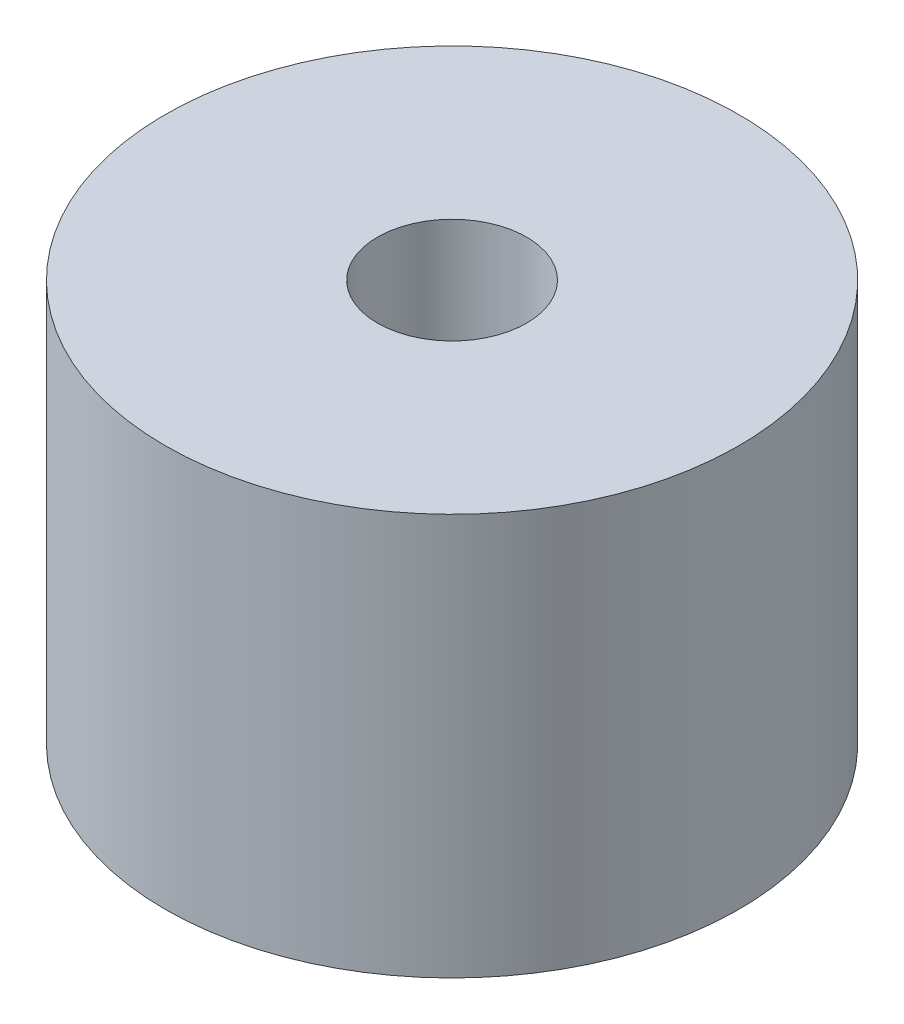
ISO-10303-21;
HEADER;
FILE_DESCRIPTION(('STEP AP214'),'2;1');
FILE_NAME('part.step','',(''),(''),'','','');
FILE_SCHEMA(('AUTOMOTIVE_DESIGN { 1 0 10303 214 1 1 1 1 }'));
ENDSEC;
DATA;
#1=APPLICATION_CONTEXT('core data for automotive mechanical design processes');
#2=APPLICATION_PROTOCOL_DEFINITION('international standard','automotive_design',2000,#1);
#3=PRODUCT_CONTEXT('',#1,'mechanical');
#4=PRODUCT('Part','Part','',(#3));
#5=PRODUCT_RELATED_PRODUCT_CATEGORY('part','',(#4));
#6=PRODUCT_DEFINITION_FORMATION('','',#4);
#7=PRODUCT_DEFINITION_CONTEXT('part definition',#1,'design');
#8=PRODUCT_DEFINITION('design','',#6,#7);
#9=PRODUCT_DEFINITION_SHAPE('','',#8);
#10=(LENGTH_UNIT() NAMED_UNIT(*) SI_UNIT(.MILLI.,.METRE.));
#11=(NAMED_UNIT(*) PLANE_ANGLE_UNIT() SI_UNIT($,.RADIAN.));
#12=(NAMED_UNIT(*) SI_UNIT($,.STERADIAN.) SOLID_ANGLE_UNIT());
#13=UNCERTAINTY_MEASURE_WITH_UNIT(LENGTH_MEASURE(1.E-05),#10,'distance_accuracy_value','');
#14=(GEOMETRIC_REPRESENTATION_CONTEXT(3) GLOBAL_UNCERTAINTY_ASSIGNED_CONTEXT((#13)) GLOBAL_UNIT_ASSIGNED_CONTEXT((#10,
#11,#12)) REPRESENTATION_CONTEXT('',''));
#15=CARTESIAN_POINT('',(0.,0.,0.));
#16=DIRECTION('',(0.,0.,1.));
#17=DIRECTION('',(1.,0.,0.));
#18=AXIS2_PLACEMENT_3D('',#15,#16,#17);
#19=CARTESIAN_POINT('',(0.,35.,0.));
#20=DIRECTION('',(0.,-1.,0.));
#21=DIRECTION('',(0.,0.,-1.));
#22=AXIS2_PLACEMENT_3D('',#19,#20,#21);
#23=CYLINDRICAL_SURFACE('',#22,25.);
#24=CARTESIAN_POINT('',(0.,35.,0.));
#25=DIRECTION('',(0.,1.,0.));
#26=DIRECTION('',(0.,0.,1.));
#27=AXIS2_PLACEMENT_3D('',#24,#25,#26);
#28=CIRCLE('',#27,25.);
#29=CARTESIAN_POINT('',(0.,35.,25.));
#30=VERTEX_POINT('',#29);
#31=EDGE_CURVE('E10',#30,#30,#28,.T.);
#32=ORIENTED_EDGE('',*,*,#31,.F.);
#33=EDGE_LOOP('',(#32));
#34=FACE_BOUND('',#33,.T.);
#35=CARTESIAN_POINT('',(0.,0.,0.));
#36=DIRECTION('',(0.,1.,0.));
#37=DIRECTION('',(0.,0.,1.));
#38=AXIS2_PLACEMENT_3D('',#35,#36,#37);
#39=CIRCLE('',#38,25.);
#40=CARTESIAN_POINT('',(0.,0.,25.));
#41=VERTEX_POINT('',#40);
#42=EDGE_CURVE('E40',#41,#41,#39,.T.);
#43=ORIENTED_EDGE('',*,*,#42,.T.);
#44=EDGE_LOOP('',(#43));
#45=FACE_BOUND('',#44,.T.);
#46=ADVANCED_FACE('F37',(#34,#45),#23,.T.);
#47=CARTESIAN_POINT('',(0.,35.,0.));
#48=DIRECTION('',(0.,1.,0.));
#49=DIRECTION('',(0.,0.,1.));
#50=AXIS2_PLACEMENT_3D('',#47,#48,#49);
#51=PLANE('',#50);
#52=CARTESIAN_POINT('',(0.,35.,0.));
#53=DIRECTION('',(0.,1.,0.));
#54=DIRECTION('',(0.,0.,1.));
#55=AXIS2_PLACEMENT_3D('',#52,#53,#54);
#56=CIRCLE('',#55,6.5);
#57=CARTESIAN_POINT('',(0.,35.,6.5));
#58=VERTEX_POINT('',#57);
#59=EDGE_CURVE('E51',#58,#58,#56,.T.);
#60=ORIENTED_EDGE('',*,*,#59,.F.);
#61=EDGE_LOOP('',(#60));
#62=FACE_BOUND('',#61,.T.);
#63=ORIENTED_EDGE('',*,*,#31,.T.);
#64=EDGE_LOOP('',(#63));
#65=FACE_BOUND('',#64,.T.);
#66=ADVANCED_FACE('F108',(#62,#65),#51,.T.);
#67=CARTESIAN_POINT('',(0.,0.,0.));
#68=DIRECTION('',(0.,1.,0.));
#69=DIRECTION('',(0.,0.,1.));
#70=AXIS2_PLACEMENT_3D('',#67,#68,#69);
#71=PLANE('',#70);
#72=CARTESIAN_POINT('',(0.,0.,0.));
#73=DIRECTION('',(0.,1.,0.));
#74=DIRECTION('',(0.,0.,1.));
#75=AXIS2_PLACEMENT_3D('',#72,#73,#74);
#76=CIRCLE('',#75,1.5);
#77=CARTESIAN_POINT('',(0.,0.,1.5));
#78=VERTEX_POINT('',#77);
#79=EDGE_CURVE('E63',#78,#78,#76,.T.);
#80=ORIENTED_EDGE('',*,*,#79,.T.);
#81=EDGE_LOOP('',(#80));
#82=FACE_BOUND('',#81,.T.);
#83=ORIENTED_EDGE('',*,*,#42,.F.);
#84=EDGE_LOOP('',(#83));
#85=FACE_BOUND('',#84,.T.);
#86=ADVANCED_FACE('F75',(#82,#85),#71,.F.);
#87=CARTESIAN_POINT('',(0.,5.,0.));
#88=DIRECTION('',(0.,1.,0.));
#89=DIRECTION('',(0.,0.,1.));
#90=AXIS2_PLACEMENT_3D('',#87,#88,#89);
#91=CYLINDRICAL_SURFACE('',#90,6.5);
#92=CARTESIAN_POINT('',(0.,5.,0.));
#93=DIRECTION('',(0.,1.,0.));
#94=DIRECTION('',(0.,0.,1.));
#95=AXIS2_PLACEMENT_3D('',#92,#93,#94);
#96=CIRCLE('',#95,6.5);
#97=CARTESIAN_POINT('',(0.,5.,6.5));
#98=VERTEX_POINT('',#97);
#99=EDGE_CURVE('E49',#98,#98,#96,.T.);
#100=ORIENTED_EDGE('',*,*,#99,.F.);
#101=EDGE_LOOP('',(#100));
#102=FACE_BOUND('',#101,.T.);
#103=ORIENTED_EDGE('',*,*,#59,.T.);
#104=EDGE_LOOP('',(#103));
#105=FACE_BOUND('',#104,.T.);
#106=ADVANCED_FACE('F99',(#102,#105),#91,.F.);
#107=CARTESIAN_POINT('',(0.,5.,0.));
#108=DIRECTION('',(0.,1.,0.));
#109=DIRECTION('',(0.,0.,1.));
#110=AXIS2_PLACEMENT_3D('',#107,#108,#109);
#111=PLANE('',#110);
#112=CARTESIAN_POINT('',(0.,5.,0.));
#113=DIRECTION('',(0.,1.,0.));
#114=DIRECTION('',(0.,0.,1.));
#115=AXIS2_PLACEMENT_3D('',#112,#113,#114);
#116=CIRCLE('',#115,2.5);
#117=CARTESIAN_POINT('',(0.,5.,2.5));
#118=VERTEX_POINT('',#117);
#119=EDGE_CURVE('E59',#118,#118,#116,.T.);
#120=ORIENTED_EDGE('',*,*,#119,.F.);
#121=EDGE_LOOP('',(#120));
#122=FACE_BOUND('',#121,.T.);
#123=ORIENTED_EDGE('',*,*,#99,.T.);
#124=EDGE_LOOP('',(#123));
#125=FACE_BOUND('',#124,.T.);
#126=ADVANCED_FACE('F93',(#122,#125),#111,.T.);
#127=CARTESIAN_POINT('',(0.,2.,0.));
#128=DIRECTION('',(0.,1.,0.));
#129=DIRECTION('',(0.,0.,1.));
#130=AXIS2_PLACEMENT_3D('',#127,#128,#129);
#131=CYLINDRICAL_SURFACE('',#130,2.5);
#132=CARTESIAN_POINT('',(0.,2.,0.));
#133=DIRECTION('',(0.,1.,0.));
#134=DIRECTION('',(0.,0.,1.));
#135=AXIS2_PLACEMENT_3D('',#132,#133,#134);
#136=CIRCLE('',#135,2.5);
#137=CARTESIAN_POINT('',(0.,2.,2.5));
#138=VERTEX_POINT('',#137);
#139=EDGE_CURVE('E55',#138,#138,#136,.T.);
#140=ORIENTED_EDGE('',*,*,#139,.F.);
#141=EDGE_LOOP('',(#140));
#142=FACE_BOUND('',#141,.T.);
#143=ORIENTED_EDGE('',*,*,#119,.T.);
#144=EDGE_LOOP('',(#143));
#145=FACE_BOUND('',#144,.T.);
#146=ADVANCED_FACE('F87',(#142,#145),#131,.F.);
#147=CARTESIAN_POINT('',(0.,2.,0.));
#148=DIRECTION('',(0.,1.,0.));
#149=DIRECTION('',(0.,0.,1.));
#150=AXIS2_PLACEMENT_3D('',#147,#148,#149);
#151=PLANE('',#150);
#152=CARTESIAN_POINT('',(0.,2.,0.));
#153=DIRECTION('',(0.,1.,0.));
#154=DIRECTION('',(0.,0.,1.));
#155=AXIS2_PLACEMENT_3D('',#152,#153,#154);
#156=CIRCLE('',#155,1.5);
#157=CARTESIAN_POINT('',(0.,2.,1.5));
#158=VERTEX_POINT('',#157);
#159=EDGE_CURVE('E67',#158,#158,#156,.T.);
#160=ORIENTED_EDGE('',*,*,#159,.F.);
#161=EDGE_LOOP('',(#160));
#162=FACE_BOUND('',#161,.T.);
#163=ORIENTED_EDGE('',*,*,#139,.T.);
#164=EDGE_LOOP('',(#163));
#165=FACE_BOUND('',#164,.T.);
#166=ADVANCED_FACE('F81',(#162,#165),#151,.T.);
#167=CARTESIAN_POINT('',(0.,0.,0.));
#168=DIRECTION('',(0.,1.,0.));
#169=DIRECTION('',(0.,0.,1.));
#170=AXIS2_PLACEMENT_3D('',#167,#168,#169);
#171=CYLINDRICAL_SURFACE('',#170,1.5);
#172=ORIENTED_EDGE('',*,*,#79,.F.);
#173=EDGE_LOOP('',(#172));
#174=FACE_BOUND('',#173,.T.);
#175=ORIENTED_EDGE('',*,*,#159,.T.);
#176=EDGE_LOOP('',(#175));
#177=FACE_BOUND('',#176,.T.);
#178=ADVANCED_FACE('F78',(#174,#177),#171,.F.);
#179=CLOSED_SHELL('',(#46,#66,#86,#106,#126,#146,#166,#178));
#180=MANIFOLD_SOLID_BREP('B2',#179);
#181=ADVANCED_BREP_SHAPE_REPRESENTATION('',(#18,#180),#14);
#182=SHAPE_DEFINITION_REPRESENTATION(#9,#181);
ENDSEC;
END-ISO-10303-21;
